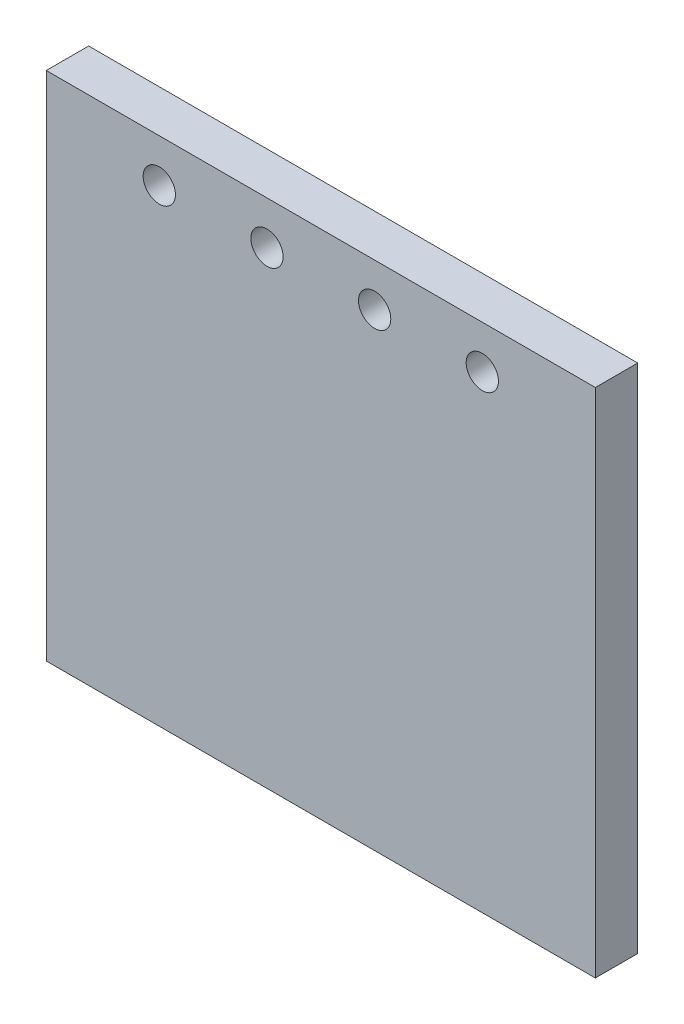
ISO-10303-21;
HEADER;
FILE_DESCRIPTION(('STEP AP214'),'2;1');
FILE_NAME('part.step','',(''),(''),'','','');
FILE_SCHEMA(('AUTOMOTIVE_DESIGN { 1 0 10303 214 1 1 1 1 }'));
ENDSEC;
DATA;
#1=APPLICATION_CONTEXT('core data for automotive mechanical design processes');
#2=APPLICATION_PROTOCOL_DEFINITION('international standard','automotive_design',2000,#1);
#3=PRODUCT_CONTEXT('',#1,'mechanical');
#4=PRODUCT('Part','Part','',(#3));
#5=PRODUCT_RELATED_PRODUCT_CATEGORY('part','',(#4));
#6=PRODUCT_DEFINITION_FORMATION('','',#4);
#7=PRODUCT_DEFINITION_CONTEXT('part definition',#1,'design');
#8=PRODUCT_DEFINITION('design','',#6,#7);
#9=PRODUCT_DEFINITION_SHAPE('','',#8);
#10=(LENGTH_UNIT() NAMED_UNIT(*) SI_UNIT(.MILLI.,.METRE.));
#11=(NAMED_UNIT(*) PLANE_ANGLE_UNIT() SI_UNIT($,.RADIAN.));
#12=(NAMED_UNIT(*) SI_UNIT($,.STERADIAN.) SOLID_ANGLE_UNIT());
#13=UNCERTAINTY_MEASURE_WITH_UNIT(LENGTH_MEASURE(1.E-05),#10,'distance_accuracy_value','');
#14=(GEOMETRIC_REPRESENTATION_CONTEXT(3) GLOBAL_UNCERTAINTY_ASSIGNED_CONTEXT((#13)) GLOBAL_UNIT_ASSIGNED_CONTEXT((#10,
#11,#12)) REPRESENTATION_CONTEXT('',''));
#15=CARTESIAN_POINT('',(0.,0.,0.));
#16=DIRECTION('',(0.,0.,1.));
#17=DIRECTION('',(1.,0.,0.));
#18=AXIS2_PLACEMENT_3D('',#15,#16,#17);
#19=CARTESIAN_POINT('',(6.477,6.0325,0.));
#20=DIRECTION('',(0.,-1.,0.));
#21=DIRECTION('',(-1.,0.,0.));
#22=AXIS2_PLACEMENT_3D('',#19,#20,#21);
#23=PLANE('',#22);
#24=DIRECTION('',(-1.,0.,0.));
#25=VECTOR('',#24,1.);
#26=CARTESIAN_POINT('',(6.477,6.0325,0.));
#27=LINE('',#26,#25);
#28=CARTESIAN_POINT('',(6.477,6.0325,0.));
#29=VERTEX_POINT('',#28);
#30=CARTESIAN_POINT('',(-6.477,6.0325,0.));
#31=VERTEX_POINT('',#30);
#32=EDGE_CURVE('E11',#29,#31,#27,.T.);
#33=ORIENTED_EDGE('',*,*,#32,.T.);
#34=DIRECTION('',(0.,0.,1.));
#35=VECTOR('',#34,1.);
#36=CARTESIAN_POINT('',(-6.477,6.0325,0.));
#37=LINE('',#36,#35);
#38=CARTESIAN_POINT('',(-6.477,6.0325,1.00000054));
#39=VERTEX_POINT('',#38);
#40=EDGE_CURVE('E39',#31,#39,#37,.T.);
#41=ORIENTED_EDGE('',*,*,#40,.T.);
#42=DIRECTION('',(-1.,0.,0.));
#43=VECTOR('',#42,1.);
#44=CARTESIAN_POINT('',(6.477,6.0325,1.00000054));
#45=LINE('',#44,#43);
#46=CARTESIAN_POINT('',(6.477,6.0325,1.00000054));
#47=VERTEX_POINT('',#46);
#48=EDGE_CURVE('E107',#47,#39,#45,.T.);
#49=ORIENTED_EDGE('',*,*,#48,.F.);
#50=DIRECTION('',(0.,0.,1.));
#51=VECTOR('',#50,1.);
#52=CARTESIAN_POINT('',(6.477,6.0325,0.));
#53=LINE('',#52,#51);
#54=EDGE_CURVE('E51',#29,#47,#53,.T.);
#55=ORIENTED_EDGE('',*,*,#54,.F.);
#56=EDGE_LOOP('',(#33,#41,#49,#55));
#57=FACE_BOUND('',#56,.T.);
#58=ADVANCED_FACE('F32',(#57),#23,.F.);
#59=CARTESIAN_POINT('',(-6.477,6.0325,0.));
#60=DIRECTION('',(1.,0.,0.));
#61=DIRECTION('',(0.,-1.,0.));
#62=AXIS2_PLACEMENT_3D('',#59,#60,#61);
#63=PLANE('',#62);
#64=DIRECTION('',(0.,-1.,0.));
#65=VECTOR('',#64,1.);
#66=CARTESIAN_POINT('',(-6.477,6.0325,0.));
#67=LINE('',#66,#65);
#68=CARTESIAN_POINT('',(-6.477,-6.0325,0.));
#69=VERTEX_POINT('',#68);
#70=EDGE_CURVE('E104',#31,#69,#67,.T.);
#71=ORIENTED_EDGE('',*,*,#70,.T.);
#72=DIRECTION('',(0.,0.,1.));
#73=VECTOR('',#72,1.);
#74=CARTESIAN_POINT('',(-6.477,-6.0325,0.));
#75=LINE('',#74,#73);
#76=CARTESIAN_POINT('',(-6.477,-6.0325,1.00000054));
#77=VERTEX_POINT('',#76);
#78=EDGE_CURVE('E102',#69,#77,#75,.T.);
#79=ORIENTED_EDGE('',*,*,#78,.T.);
#80=DIRECTION('',(0.,-1.,0.));
#81=VECTOR('',#80,1.);
#82=CARTESIAN_POINT('',(-6.477,6.0325,1.00000054));
#83=LINE('',#82,#81);
#84=EDGE_CURVE('E77',#39,#77,#83,.T.);
#85=ORIENTED_EDGE('',*,*,#84,.F.);
#86=ORIENTED_EDGE('',*,*,#40,.F.);
#87=EDGE_LOOP('',(#71,#79,#85,#86));
#88=FACE_BOUND('',#87,.T.);
#89=ADVANCED_FACE('F109',(#88),#63,.F.);
#90=CARTESIAN_POINT('',(-6.477,-6.0325,0.));
#91=DIRECTION('',(0.,1.,0.));
#92=DIRECTION('',(1.,0.,0.));
#93=AXIS2_PLACEMENT_3D('',#90,#91,#92);
#94=PLANE('',#93);
#95=DIRECTION('',(1.,0.,0.));
#96=VECTOR('',#95,1.);
#97=CARTESIAN_POINT('',(-6.477,-6.0325,0.));
#98=LINE('',#97,#96);
#99=CARTESIAN_POINT('',(6.477,-6.0325,0.));
#100=VERTEX_POINT('',#99);
#101=EDGE_CURVE('E86',#69,#100,#98,.T.);
#102=ORIENTED_EDGE('',*,*,#101,.T.);
#103=DIRECTION('',(0.,0.,1.));
#104=VECTOR('',#103,1.);
#105=CARTESIAN_POINT('',(6.477,-6.0325,0.));
#106=LINE('',#105,#104);
#107=CARTESIAN_POINT('',(6.477,-6.0325,1.00000054));
#108=VERTEX_POINT('',#107);
#109=EDGE_CURVE('E80',#100,#108,#106,.T.);
#110=ORIENTED_EDGE('',*,*,#109,.T.);
#111=DIRECTION('',(1.,0.,0.));
#112=VECTOR('',#111,1.);
#113=CARTESIAN_POINT('',(-6.477,-6.0325,1.00000054));
#114=LINE('',#113,#112);
#115=EDGE_CURVE('E72',#77,#108,#114,.T.);
#116=ORIENTED_EDGE('',*,*,#115,.F.);
#117=ORIENTED_EDGE('',*,*,#78,.F.);
#118=EDGE_LOOP('',(#102,#110,#116,#117));
#119=FACE_BOUND('',#118,.T.);
#120=ADVANCED_FACE('F84',(#119),#94,.F.);
#121=CARTESIAN_POINT('',(6.477,-6.0325,0.));
#122=DIRECTION('',(-1.,0.,0.));
#123=DIRECTION('',(0.,1.,0.));
#124=AXIS2_PLACEMENT_3D('',#121,#122,#123);
#125=PLANE('',#124);
#126=DIRECTION('',(0.,1.,0.));
#127=VECTOR('',#126,1.);
#128=CARTESIAN_POINT('',(6.477,-6.0325,0.));
#129=LINE('',#128,#127);
#130=EDGE_CURVE('E81',#100,#29,#129,.T.);
#131=ORIENTED_EDGE('',*,*,#130,.T.);
#132=ORIENTED_EDGE('',*,*,#54,.T.);
#133=DIRECTION('',(0.,1.,0.));
#134=VECTOR('',#133,1.);
#135=CARTESIAN_POINT('',(6.477,-6.0325,1.00000054));
#136=LINE('',#135,#134);
#137=EDGE_CURVE('E76',#108,#47,#136,.T.);
#138=ORIENTED_EDGE('',*,*,#137,.F.);
#139=ORIENTED_EDGE('',*,*,#109,.F.);
#140=EDGE_LOOP('',(#131,#132,#138,#139));
#141=FACE_BOUND('',#140,.T.);
#142=ADVANCED_FACE('F91',(#141),#125,.F.);
#143=CARTESIAN_POINT('',(0.,0.,0.));
#144=DIRECTION('',(0.,0.,1.));
#145=DIRECTION('',(1.,0.,0.));
#146=AXIS2_PLACEMENT_3D('',#143,#144,#145);
#147=PLANE('',#146);
#148=CARTESIAN_POINT('',(-3.810000579834,5.016501739502,0.));
#149=DIRECTION('',(0.,0.,1.));
#150=DIRECTION('',(1.,0.,0.));
#151=AXIS2_PLACEMENT_3D('',#148,#149,#150);
#152=CIRCLE('',#151,0.380999999999999);
#153=CARTESIAN_POINT('',(-3.429000579834,5.016501739502,0.));
#154=VERTEX_POINT('',#153);
#155=EDGE_CURVE('E92',#154,#154,#152,.T.);
#156=ORIENTED_EDGE('',*,*,#155,.T.);
#157=EDGE_LOOP('',(#156));
#158=FACE_BOUND('',#157,.T.);
#159=CARTESIAN_POINT('',(-1.270000579834,5.016501739502,0.));
#160=DIRECTION('',(0.,0.,1.));
#161=DIRECTION('',(1.,0.,0.));
#162=AXIS2_PLACEMENT_3D('',#159,#160,#161);
#163=CIRCLE('',#162,0.380999999999999);
#164=CARTESIAN_POINT('',(-0.889000579834001,5.016501739502,0.));
#165=VERTEX_POINT('',#164);
#166=EDGE_CURVE('E96',#165,#165,#163,.T.);
#167=ORIENTED_EDGE('',*,*,#166,.T.);
#168=EDGE_LOOP('',(#167));
#169=FACE_BOUND('',#168,.T.);
#170=CARTESIAN_POINT('',(1.269999420166,5.016501739502,0.));
#171=DIRECTION('',(0.,0.,1.));
#172=DIRECTION('',(1.,0.,0.));
#173=AXIS2_PLACEMENT_3D('',#170,#171,#172);
#174=CIRCLE('',#173,0.380999999999999);
#175=CARTESIAN_POINT('',(1.650999420166,5.016501739502,0.));
#176=VERTEX_POINT('',#175);
#177=EDGE_CURVE('E210',#176,#176,#174,.T.);
#178=ORIENTED_EDGE('',*,*,#177,.T.);
#179=EDGE_LOOP('',(#178));
#180=FACE_BOUND('',#179,.T.);
#181=CARTESIAN_POINT('',(3.809999420166,5.016501739502,0.));
#182=DIRECTION('',(0.,0.,1.));
#183=DIRECTION('',(1.,0.,0.));
#184=AXIS2_PLACEMENT_3D('',#181,#182,#183);
#185=CIRCLE('',#184,0.381);
#186=CARTESIAN_POINT('',(4.190999420166,5.016501739502,0.));
#187=VERTEX_POINT('',#186);
#188=EDGE_CURVE('E206',#187,#187,#185,.T.);
#189=ORIENTED_EDGE('',*,*,#188,.T.);
#190=EDGE_LOOP('',(#189));
#191=FACE_BOUND('',#190,.T.);
#192=ORIENTED_EDGE('',*,*,#130,.F.);
#193=ORIENTED_EDGE('',*,*,#101,.F.);
#194=ORIENTED_EDGE('',*,*,#70,.F.);
#195=ORIENTED_EDGE('',*,*,#32,.F.);
#196=EDGE_LOOP('',(#192,#193,#194,#195));
#197=FACE_BOUND('',#196,.T.);
#198=ADVANCED_FACE('F111',(#158,#169,#180,#191,#197),#147,.F.);
#199=CARTESIAN_POINT('',(0.,0.,1.00000054));
#200=DIRECTION('',(0.,0.,1.));
#201=DIRECTION('',(1.,0.,0.));
#202=AXIS2_PLACEMENT_3D('',#199,#200,#201);
#203=PLANE('',#202);
#204=CARTESIAN_POINT('',(-3.810000579834,5.016501739502,1.00000054));
#205=DIRECTION('',(0.,0.,1.));
#206=DIRECTION('',(1.,0.,0.));
#207=AXIS2_PLACEMENT_3D('',#204,#205,#206);
#208=CIRCLE('',#207,0.380999999999999);
#209=CARTESIAN_POINT('',(-3.429000579834,5.016501739502,1.00000054));
#210=VERTEX_POINT('',#209);
#211=EDGE_CURVE('E204',#210,#210,#208,.T.);
#212=ORIENTED_EDGE('',*,*,#211,.F.);
#213=EDGE_LOOP('',(#212));
#214=FACE_BOUND('',#213,.T.);
#215=CARTESIAN_POINT('',(-1.270000579834,5.016501739502,1.00000054));
#216=DIRECTION('',(0.,0.,1.));
#217=DIRECTION('',(1.,0.,0.));
#218=AXIS2_PLACEMENT_3D('',#215,#216,#217);
#219=CIRCLE('',#218,0.380999999999999);
#220=CARTESIAN_POINT('',(-0.889000579834001,5.016501739502,1.00000054));
#221=VERTEX_POINT('',#220);
#222=EDGE_CURVE('E207',#221,#221,#219,.T.);
#223=ORIENTED_EDGE('',*,*,#222,.F.);
#224=EDGE_LOOP('',(#223));
#225=FACE_BOUND('',#224,.T.);
#226=CARTESIAN_POINT('',(1.269999420166,5.016501739502,1.00000054));
#227=DIRECTION('',(0.,0.,1.));
#228=DIRECTION('',(1.,0.,0.));
#229=AXIS2_PLACEMENT_3D('',#226,#227,#228);
#230=CIRCLE('',#229,0.380999999999999);
#231=CARTESIAN_POINT('',(1.650999420166,5.016501739502,1.00000054));
#232=VERTEX_POINT('',#231);
#233=EDGE_CURVE('E213',#232,#232,#230,.T.);
#234=ORIENTED_EDGE('',*,*,#233,.F.);
#235=EDGE_LOOP('',(#234));
#236=FACE_BOUND('',#235,.T.);
#237=CARTESIAN_POINT('',(3.809999420166,5.016501739502,1.00000054));
#238=DIRECTION('',(0.,0.,1.));
#239=DIRECTION('',(1.,0.,0.));
#240=AXIS2_PLACEMENT_3D('',#237,#238,#239);
#241=CIRCLE('',#240,0.381);
#242=CARTESIAN_POINT('',(4.190999420166,5.016501739502,1.00000054));
#243=VERTEX_POINT('',#242);
#244=EDGE_CURVE('E218',#243,#243,#241,.T.);
#245=ORIENTED_EDGE('',*,*,#244,.F.);
#246=EDGE_LOOP('',(#245));
#247=FACE_BOUND('',#246,.T.);
#248=ORIENTED_EDGE('',*,*,#48,.T.);
#249=ORIENTED_EDGE('',*,*,#84,.T.);
#250=ORIENTED_EDGE('',*,*,#115,.T.);
#251=ORIENTED_EDGE('',*,*,#137,.T.);
#252=EDGE_LOOP('',(#248,#249,#250,#251));
#253=FACE_BOUND('',#252,.T.);
#254=ADVANCED_FACE('F74',(#214,#225,#236,#247,#253),#203,.T.);
#255=CARTESIAN_POINT('',(3.809999420166,5.016501739502,-8.99999946));
#256=DIRECTION('',(0.,0.,1.));
#257=DIRECTION('',(1.,0.,0.));
#258=AXIS2_PLACEMENT_3D('',#255,#256,#257);
#259=CYLINDRICAL_SURFACE('',#258,0.381);
#260=ORIENTED_EDGE('',*,*,#244,.T.);
#261=EDGE_LOOP('',(#260));
#262=FACE_BOUND('',#261,.T.);
#263=ORIENTED_EDGE('',*,*,#188,.F.);
#264=EDGE_LOOP('',(#263));
#265=FACE_BOUND('',#264,.T.);
#266=ADVANCED_FACE('F119',(#262,#265),#259,.F.);
#267=CARTESIAN_POINT('',(1.269999420166,5.016501739502,-8.99999946));
#268=DIRECTION('',(0.,0.,1.));
#269=DIRECTION('',(1.,0.,0.));
#270=AXIS2_PLACEMENT_3D('',#267,#268,#269);
#271=CYLINDRICAL_SURFACE('',#270,0.380999999999999);
#272=ORIENTED_EDGE('',*,*,#233,.T.);
#273=EDGE_LOOP('',(#272));
#274=FACE_BOUND('',#273,.T.);
#275=ORIENTED_EDGE('',*,*,#177,.F.);
#276=EDGE_LOOP('',(#275));
#277=FACE_BOUND('',#276,.T.);
#278=ADVANCED_FACE('F145',(#274,#277),#271,.F.);
#279=CARTESIAN_POINT('',(-1.270000579834,5.016501739502,-8.99999946));
#280=DIRECTION('',(0.,0.,1.));
#281=DIRECTION('',(1.,0.,0.));
#282=AXIS2_PLACEMENT_3D('',#279,#280,#281);
#283=CYLINDRICAL_SURFACE('',#282,0.380999999999999);
#284=ORIENTED_EDGE('',*,*,#222,.T.);
#285=EDGE_LOOP('',(#284));
#286=FACE_BOUND('',#285,.T.);
#287=ORIENTED_EDGE('',*,*,#166,.F.);
#288=EDGE_LOOP('',(#287));
#289=FACE_BOUND('',#288,.T.);
#290=ADVANCED_FACE('F154',(#286,#289),#283,.F.);
#291=CARTESIAN_POINT('',(-3.810000579834,5.016501739502,-8.99999946));
#292=DIRECTION('',(0.,0.,1.));
#293=DIRECTION('',(1.,0.,0.));
#294=AXIS2_PLACEMENT_3D('',#291,#292,#293);
#295=CYLINDRICAL_SURFACE('',#294,0.380999999999999);
#296=ORIENTED_EDGE('',*,*,#211,.T.);
#297=EDGE_LOOP('',(#296));
#298=FACE_BOUND('',#297,.T.);
#299=ORIENTED_EDGE('',*,*,#155,.F.);
#300=EDGE_LOOP('',(#299));
#301=FACE_BOUND('',#300,.T.);
#302=ADVANCED_FACE('F163',(#298,#301),#295,.F.);
#303=CLOSED_SHELL('',(#58,#89,#120,#142,#198,#254,#266,#278,#290,#302));
#304=MANIFOLD_SOLID_BREP('B2',#303);
#305=ADVANCED_BREP_SHAPE_REPRESENTATION('',(#18,#304),#14);
#306=SHAPE_DEFINITION_REPRESENTATION(#9,#305);
ENDSEC;
END-ISO-10303-21;
